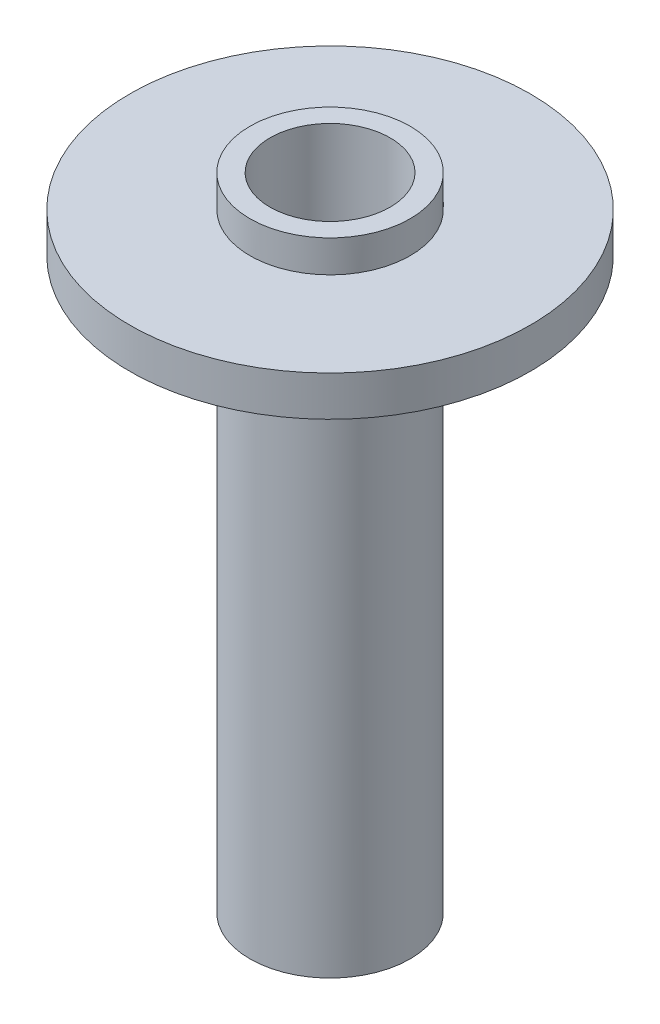
ISO-10303-21;
HEADER;
FILE_DESCRIPTION(('STEP AP214'),'2;1');
FILE_NAME('part.step','',(''),(''),'','','');
FILE_SCHEMA(('AUTOMOTIVE_DESIGN { 1 0 10303 214 1 1 1 1 }'));
ENDSEC;
DATA;
#1=APPLICATION_CONTEXT('core data for automotive mechanical design processes');
#2=APPLICATION_PROTOCOL_DEFINITION('international standard','automotive_design',2000,#1);
#3=PRODUCT_CONTEXT('',#1,'mechanical');
#4=PRODUCT('Part','Part','',(#3));
#5=PRODUCT_RELATED_PRODUCT_CATEGORY('part','',(#4));
#6=PRODUCT_DEFINITION_FORMATION('','',#4);
#7=PRODUCT_DEFINITION_CONTEXT('part definition',#1,'design');
#8=PRODUCT_DEFINITION('design','',#6,#7);
#9=PRODUCT_DEFINITION_SHAPE('','',#8);
#10=(LENGTH_UNIT() NAMED_UNIT(*) SI_UNIT(.MILLI.,.METRE.));
#11=(NAMED_UNIT(*) PLANE_ANGLE_UNIT() SI_UNIT($,.RADIAN.));
#12=(NAMED_UNIT(*) SI_UNIT($,.STERADIAN.) SOLID_ANGLE_UNIT());
#13=UNCERTAINTY_MEASURE_WITH_UNIT(LENGTH_MEASURE(1.E-05),#10,'distance_accuracy_value','');
#14=(GEOMETRIC_REPRESENTATION_CONTEXT(3) GLOBAL_UNCERTAINTY_ASSIGNED_CONTEXT((#13)) GLOBAL_UNIT_ASSIGNED_CONTEXT((#10,
#11,#12)) REPRESENTATION_CONTEXT('',''));
#15=CARTESIAN_POINT('',(0.,0.,0.));
#16=DIRECTION('',(0.,0.,1.));
#17=DIRECTION('',(1.,0.,0.));
#18=AXIS2_PLACEMENT_3D('',#15,#16,#17);
#19=CARTESIAN_POINT('',(0.,80.,0.));
#20=DIRECTION('',(0.,-1.,0.));
#21=DIRECTION('',(0.,0.,-1.));
#22=AXIS2_PLACEMENT_3D('',#19,#20,#21);
#23=CYLINDRICAL_SURFACE('',#22,10.);
#24=CARTESIAN_POINT('',(0.,80.,0.));
#25=DIRECTION('',(0.,1.,0.));
#26=DIRECTION('',(0.,0.,1.));
#27=AXIS2_PLACEMENT_3D('',#24,#25,#26);
#28=CIRCLE('',#27,10.);
#29=CARTESIAN_POINT('',(0.,80.,10.));
#30=VERTEX_POINT('',#29);
#31=EDGE_CURVE('E49',#30,#30,#28,.T.);
#32=ORIENTED_EDGE('',*,*,#31,.F.);
#33=EDGE_LOOP('',(#32));
#34=FACE_BOUND('',#33,.T.);
#35=CARTESIAN_POINT('',(0.,76.,0.));
#36=DIRECTION('',(0.,-1.,0.));
#37=DIRECTION('',(0.,0.,-1.));
#38=AXIS2_PLACEMENT_3D('',#35,#36,#37);
#39=CIRCLE('',#38,10.);
#40=CARTESIAN_POINT('',(0.,76.,-10.));
#41=VERTEX_POINT('',#40);
#42=EDGE_CURVE('E11',#41,#41,#39,.T.);
#43=ORIENTED_EDGE('',*,*,#42,.F.);
#44=EDGE_LOOP('',(#43));
#45=FACE_BOUND('',#44,.T.);
#46=ADVANCED_FACE('F42',(#34,#45),#23,.T.);
#47=CARTESIAN_POINT('',(0.,80.,0.));
#48=DIRECTION('',(0.,1.,0.));
#49=DIRECTION('',(0.,0.,1.));
#50=AXIS2_PLACEMENT_3D('',#47,#48,#49);
#51=PLANE('',#50);
#52=ORIENTED_EDGE('',*,*,#31,.T.);
#53=EDGE_LOOP('',(#52));
#54=FACE_BOUND('',#53,.T.);
#55=CARTESIAN_POINT('',(0.,80.,0.));
#56=DIRECTION('',(0.,1.,0.));
#57=DIRECTION('',(0.,0.,1.));
#58=AXIS2_PLACEMENT_3D('',#55,#56,#57);
#59=CIRCLE('',#58,7.5);
#60=CARTESIAN_POINT('',(0.,80.,7.5));
#61=VERTEX_POINT('',#60);
#62=EDGE_CURVE('E58',#61,#61,#59,.T.);
#63=ORIENTED_EDGE('',*,*,#62,.F.);
#64=EDGE_LOOP('',(#63));
#65=FACE_BOUND('',#64,.T.);
#66=ADVANCED_FACE('F87',(#54,#65),#51,.T.);
#67=CARTESIAN_POINT('',(0.,0.,0.));
#68=DIRECTION('',(0.,1.,0.));
#69=DIRECTION('',(0.,0.,1.));
#70=AXIS2_PLACEMENT_3D('',#67,#68,#69);
#71=PLANE('',#70);
#72=CARTESIAN_POINT('',(0.,0.,0.));
#73=DIRECTION('',(0.,1.,0.));
#74=DIRECTION('',(0.,0.,1.));
#75=AXIS2_PLACEMENT_3D('',#72,#73,#74);
#76=CIRCLE('',#75,10.);
#77=CARTESIAN_POINT('',(0.,0.,10.));
#78=VERTEX_POINT('',#77);
#79=EDGE_CURVE('E53',#78,#78,#76,.T.);
#80=ORIENTED_EDGE('',*,*,#79,.F.);
#81=EDGE_LOOP('',(#80));
#82=FACE_BOUND('',#81,.T.);
#83=CARTESIAN_POINT('',(0.,0.,0.));
#84=DIRECTION('',(0.,1.,0.));
#85=DIRECTION('',(0.,0.,1.));
#86=AXIS2_PLACEMENT_3D('',#83,#84,#85);
#87=CIRCLE('',#86,7.5);
#88=CARTESIAN_POINT('',(0.,0.,7.5));
#89=VERTEX_POINT('',#88);
#90=EDGE_CURVE('E60',#89,#89,#87,.T.);
#91=ORIENTED_EDGE('',*,*,#90,.T.);
#92=EDGE_LOOP('',(#91));
#93=FACE_BOUND('',#92,.T.);
#94=ADVANCED_FACE('F92',(#82,#93),#71,.F.);
#95=CARTESIAN_POINT('',(0.,71.,0.));
#96=DIRECTION('',(0.,-1.,0.));
#97=DIRECTION('',(0.,0.,-1.));
#98=AXIS2_PLACEMENT_3D('',#95,#96,#97);
#99=CIRCLE('',#98,10.);
#100=CARTESIAN_POINT('',(0.,71.,-10.));
#101=VERTEX_POINT('',#100);
#102=EDGE_CURVE('E63',#101,#101,#99,.T.);
#103=ORIENTED_EDGE('',*,*,#102,.T.);
#104=EDGE_LOOP('',(#103));
#105=FACE_BOUND('',#104,.T.);
#106=ORIENTED_EDGE('',*,*,#79,.T.);
#107=EDGE_LOOP('',(#106));
#108=FACE_BOUND('',#107,.T.);
#109=ADVANCED_FACE('F44',(#105,#108),#23,.T.);
#110=CARTESIAN_POINT('',(0.,80.,0.));
#111=DIRECTION('',(0.,-1.,0.));
#112=DIRECTION('',(0.,0.,-1.));
#113=AXIS2_PLACEMENT_3D('',#110,#111,#112);
#114=CYLINDRICAL_SURFACE('',#113,7.5);
#115=ORIENTED_EDGE('',*,*,#62,.T.);
#116=EDGE_LOOP('',(#115));
#117=FACE_BOUND('',#116,.T.);
#118=ORIENTED_EDGE('',*,*,#90,.F.);
#119=EDGE_LOOP('',(#118));
#120=FACE_BOUND('',#119,.T.);
#121=ADVANCED_FACE('F96',(#117,#120),#114,.F.);
#122=CARTESIAN_POINT('',(0.,71.,-10.));
#123=DIRECTION('',(0.,-1.,0.));
#124=DIRECTION('',(0.,0.,-1.));
#125=AXIS2_PLACEMENT_3D('',#122,#123,#124);
#126=PLANE('',#125);
#127=CARTESIAN_POINT('',(0.,71.,0.));
#128=DIRECTION('',(0.,-1.,0.));
#129=DIRECTION('',(0.,0.,-1.));
#130=AXIS2_PLACEMENT_3D('',#127,#128,#129);
#131=CIRCLE('',#130,25.);
#132=CARTESIAN_POINT('',(0.,71.,-25.));
#133=VERTEX_POINT('',#132);
#134=EDGE_CURVE('E68',#133,#133,#131,.T.);
#135=ORIENTED_EDGE('',*,*,#134,.T.);
#136=EDGE_LOOP('',(#135));
#137=FACE_BOUND('',#136,.T.);
#138=ORIENTED_EDGE('',*,*,#102,.F.);
#139=EDGE_LOOP('',(#138));
#140=FACE_BOUND('',#139,.T.);
#141=ADVANCED_FACE('F83',(#137,#140),#126,.T.);
#142=CARTESIAN_POINT('',(0.,0.,0.));
#143=DIRECTION('',(0.,-1.,0.));
#144=DIRECTION('',(0.,0.,-1.));
#145=AXIS2_PLACEMENT_3D('',#142,#143,#144);
#146=CYLINDRICAL_SURFACE('',#145,25.);
#147=ORIENTED_EDGE('',*,*,#134,.F.);
#148=EDGE_LOOP('',(#147));
#149=FACE_BOUND('',#148,.T.);
#150=CARTESIAN_POINT('',(0.,76.,0.));
#151=DIRECTION('',(0.,-1.,0.));
#152=DIRECTION('',(0.,0.,-1.));
#153=AXIS2_PLACEMENT_3D('',#150,#151,#152);
#154=CIRCLE('',#153,25.);
#155=CARTESIAN_POINT('',(0.,76.,-25.));
#156=VERTEX_POINT('',#155);
#157=EDGE_CURVE('E71',#156,#156,#154,.T.);
#158=ORIENTED_EDGE('',*,*,#157,.T.);
#159=EDGE_LOOP('',(#158));
#160=FACE_BOUND('',#159,.T.);
#161=ADVANCED_FACE('F75',(#149,#160),#146,.T.);
#162=CARTESIAN_POINT('',(0.,76.,-10.));
#163=DIRECTION('',(0.,-1.,0.));
#164=DIRECTION('',(0.,0.,-1.));
#165=AXIS2_PLACEMENT_3D('',#162,#163,#164);
#166=PLANE('',#165);
#167=ORIENTED_EDGE('',*,*,#157,.F.);
#168=EDGE_LOOP('',(#167));
#169=FACE_BOUND('',#168,.T.);
#170=ORIENTED_EDGE('',*,*,#42,.T.);
#171=EDGE_LOOP('',(#170));
#172=FACE_BOUND('',#171,.T.);
#173=ADVANCED_FACE('F77',(#169,#172),#166,.F.);
#174=CLOSED_SHELL('',(#46,#66,#94,#109,#121,#141,#161,#173));
#175=MANIFOLD_SOLID_BREP('B2',#174);
#176=ADVANCED_BREP_SHAPE_REPRESENTATION('',(#18,#175),#14);
#177=SHAPE_DEFINITION_REPRESENTATION(#9,#176);
ENDSEC;
END-ISO-10303-21;
